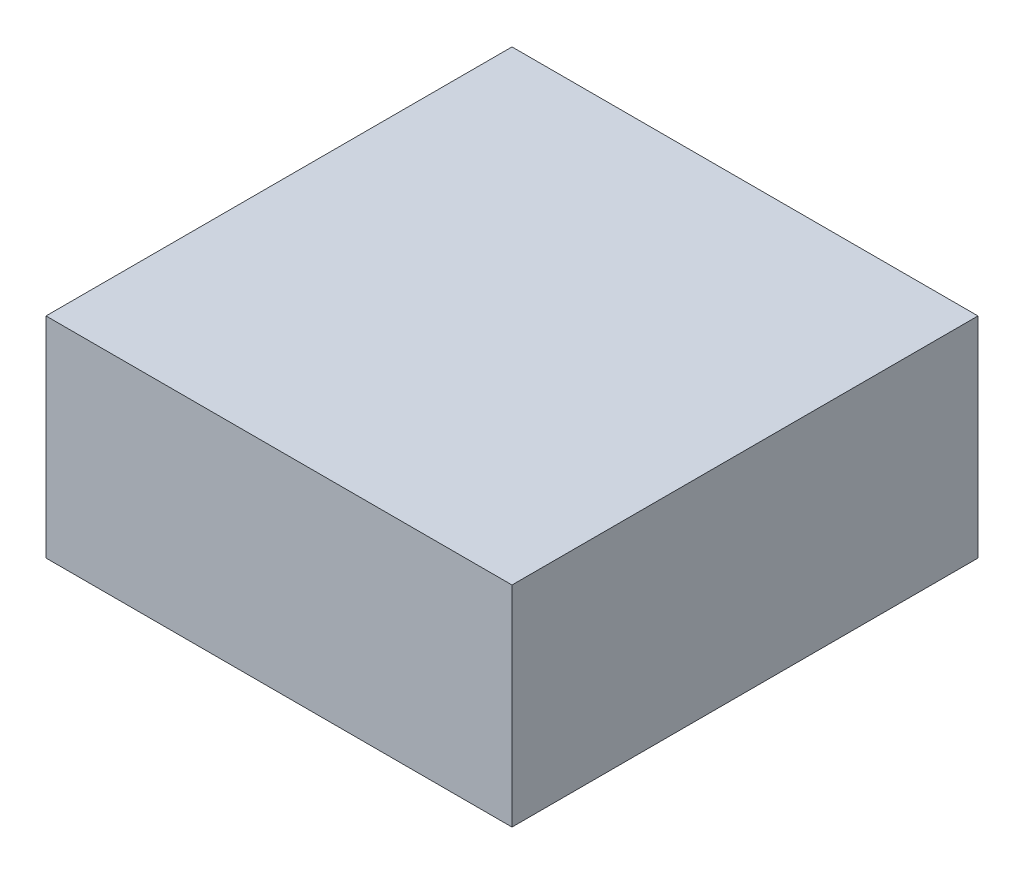
ISO-10303-21;
HEADER;
FILE_DESCRIPTION(('STEP AP214'),'2;1');
FILE_NAME('part.step','',(''),(''),'','','');
FILE_SCHEMA(('AUTOMOTIVE_DESIGN { 1 0 10303 214 1 1 1 1 }'));
ENDSEC;
DATA;
#1=APPLICATION_CONTEXT('core data for automotive mechanical design processes');
#2=APPLICATION_PROTOCOL_DEFINITION('international standard','automotive_design',2000,#1);
#3=PRODUCT_CONTEXT('',#1,'mechanical');
#4=PRODUCT('Part','Part','',(#3));
#5=PRODUCT_RELATED_PRODUCT_CATEGORY('part','',(#4));
#6=PRODUCT_DEFINITION_FORMATION('','',#4);
#7=PRODUCT_DEFINITION_CONTEXT('part definition',#1,'design');
#8=PRODUCT_DEFINITION('design','',#6,#7);
#9=PRODUCT_DEFINITION_SHAPE('','',#8);
#10=(LENGTH_UNIT() NAMED_UNIT(*) SI_UNIT(.MILLI.,.METRE.));
#11=(NAMED_UNIT(*) PLANE_ANGLE_UNIT() SI_UNIT($,.RADIAN.));
#12=(NAMED_UNIT(*) SI_UNIT($,.STERADIAN.) SOLID_ANGLE_UNIT());
#13=UNCERTAINTY_MEASURE_WITH_UNIT(LENGTH_MEASURE(1.E-05),#10,'distance_accuracy_value','');
#14=(GEOMETRIC_REPRESENTATION_CONTEXT(3) GLOBAL_UNCERTAINTY_ASSIGNED_CONTEXT((#13)) GLOBAL_UNIT_ASSIGNED_CONTEXT((#10,
#11,#12)) REPRESENTATION_CONTEXT('',''));
#15=CARTESIAN_POINT('',(0.,0.,0.));
#16=DIRECTION('',(0.,0.,1.));
#17=DIRECTION('',(1.,0.,0.));
#18=AXIS2_PLACEMENT_3D('',#15,#16,#17);
#19=CARTESIAN_POINT('',(-22.8675310919322,9.,-11.8124270711785));
#20=DIRECTION('',(1.,0.,0.));
#21=DIRECTION('',(0.,0.,-1.));
#22=AXIS2_PLACEMENT_3D('',#19,#20,#21);
#23=PLANE('',#22);
#24=DIRECTION('',(0.,0.,1.));
#25=VECTOR('',#24,1.);
#26=CARTESIAN_POINT('',(-22.8675310919322,0.,-11.8124270711785));
#27=LINE('',#26,#25);
#28=CARTESIAN_POINT('',(-22.8675310919322,0.,-11.8124270711785));
#29=VERTEX_POINT('',#28);
#30=CARTESIAN_POINT('',(-22.8675310919322,0.,8.18757292882147));
#31=VERTEX_POINT('',#30);
#32=EDGE_CURVE('E113',#29,#31,#27,.T.);
#33=ORIENTED_EDGE('',*,*,#32,.T.);
#34=DIRECTION('',(0.,-1.,0.));
#35=VECTOR('',#34,1.);
#36=CARTESIAN_POINT('',(-22.8675310919322,9.,8.18757292882147));
#37=LINE('',#36,#35);
#38=CARTESIAN_POINT('',(-22.8675310919322,9.,8.18757292882147));
#39=VERTEX_POINT('',#38);
#40=EDGE_CURVE('E11',#39,#31,#37,.T.);
#41=ORIENTED_EDGE('',*,*,#40,.F.);
#42=DIRECTION('',(0.,0.,1.));
#43=VECTOR('',#42,1.);
#44=CARTESIAN_POINT('',(-22.8675310919322,9.,-11.8124270711785));
#45=LINE('',#44,#43);
#46=CARTESIAN_POINT('',(-22.8675310919322,9.,-11.8124270711785));
#47=VERTEX_POINT('',#46);
#48=EDGE_CURVE('E97',#47,#39,#45,.T.);
#49=ORIENTED_EDGE('',*,*,#48,.F.);
#50=DIRECTION('',(0.,-1.,0.));
#51=VECTOR('',#50,1.);
#52=CARTESIAN_POINT('',(-22.8675310919322,9.,-11.8124270711785));
#53=LINE('',#52,#51);
#54=EDGE_CURVE('E109',#47,#29,#53,.T.);
#55=ORIENTED_EDGE('',*,*,#54,.T.);
#56=EDGE_LOOP('',(#33,#41,#49,#55));
#57=FACE_BOUND('',#56,.T.);
#58=ADVANCED_FACE('F45',(#57),#23,.F.);
#59=CARTESIAN_POINT('',(-22.8675310919322,9.,8.18757292882147));
#60=DIRECTION('',(0.,0.,-1.));
#61=DIRECTION('',(-1.,0.,0.));
#62=AXIS2_PLACEMENT_3D('',#59,#60,#61);
#63=PLANE('',#62);
#64=DIRECTION('',(1.,0.,0.));
#65=VECTOR('',#64,1.);
#66=CARTESIAN_POINT('',(-22.8675310919322,0.,8.18757292882147));
#67=LINE('',#66,#65);
#68=CARTESIAN_POINT('',(-2.86753109193223,0.,8.18757292882147));
#69=VERTEX_POINT('',#68);
#70=EDGE_CURVE('E102',#31,#69,#67,.T.);
#71=ORIENTED_EDGE('',*,*,#70,.T.);
#72=DIRECTION('',(0.,-1.,0.));
#73=VECTOR('',#72,1.);
#74=CARTESIAN_POINT('',(-2.86753109193223,9.,8.18757292882147));
#75=LINE('',#74,#73);
#76=CARTESIAN_POINT('',(-2.86753109193223,9.,8.18757292882147));
#77=VERTEX_POINT('',#76);
#78=EDGE_CURVE('E54',#77,#69,#75,.T.);
#79=ORIENTED_EDGE('',*,*,#78,.F.);
#80=DIRECTION('',(1.,0.,0.));
#81=VECTOR('',#80,1.);
#82=CARTESIAN_POINT('',(-22.8675310919322,9.,8.18757292882147));
#83=LINE('',#82,#81);
#84=EDGE_CURVE('E92',#39,#77,#83,.T.);
#85=ORIENTED_EDGE('',*,*,#84,.F.);
#86=ORIENTED_EDGE('',*,*,#40,.T.);
#87=EDGE_LOOP('',(#71,#79,#85,#86));
#88=FACE_BOUND('',#87,.T.);
#89=ADVANCED_FACE('F101',(#88),#63,.F.);
#90=CARTESIAN_POINT('',(-2.86753109193223,9.,-11.8124270711785));
#91=DIRECTION('',(-1.,0.,0.));
#92=DIRECTION('',(0.,0.,1.));
#93=AXIS2_PLACEMENT_3D('',#90,#91,#92);
#94=PLANE('',#93);
#95=DIRECTION('',(0.,0.,-1.));
#96=VECTOR('',#95,1.);
#97=CARTESIAN_POINT('',(-2.86753109193223,0.,-11.8124270711785));
#98=LINE('',#97,#96);
#99=CARTESIAN_POINT('',(-2.86753109193223,0.,-11.8124270711785));
#100=VERTEX_POINT('',#99);
#101=EDGE_CURVE('E79',#69,#100,#98,.T.);
#102=ORIENTED_EDGE('',*,*,#101,.T.);
#103=DIRECTION('',(0.,-1.,0.));
#104=VECTOR('',#103,1.);
#105=CARTESIAN_POINT('',(-2.86753109193223,9.,-11.8124270711785));
#106=LINE('',#105,#104);
#107=CARTESIAN_POINT('',(-2.86753109193223,9.,-11.8124270711785));
#108=VERTEX_POINT('',#107);
#109=EDGE_CURVE('E104',#108,#100,#106,.T.);
#110=ORIENTED_EDGE('',*,*,#109,.F.);
#111=DIRECTION('',(0.,0.,-1.));
#112=VECTOR('',#111,1.);
#113=CARTESIAN_POINT('',(-2.86753109193223,9.,-11.8124270711785));
#114=LINE('',#113,#112);
#115=EDGE_CURVE('E95',#77,#108,#114,.T.);
#116=ORIENTED_EDGE('',*,*,#115,.F.);
#117=ORIENTED_EDGE('',*,*,#78,.T.);
#118=EDGE_LOOP('',(#102,#110,#116,#117));
#119=FACE_BOUND('',#118,.T.);
#120=ADVANCED_FACE('F105',(#119),#94,.F.);
#121=CARTESIAN_POINT('',(-22.8675310919322,9.,-11.8124270711785));
#122=DIRECTION('',(0.,0.,1.));
#123=DIRECTION('',(1.,0.,0.));
#124=AXIS2_PLACEMENT_3D('',#121,#122,#123);
#125=PLANE('',#124);
#126=DIRECTION('',(-1.,0.,0.));
#127=VECTOR('',#126,1.);
#128=CARTESIAN_POINT('',(-22.8675310919322,0.,-11.8124270711785));
#129=LINE('',#128,#127);
#130=EDGE_CURVE('E85',#100,#29,#129,.T.);
#131=ORIENTED_EDGE('',*,*,#130,.T.);
#132=ORIENTED_EDGE('',*,*,#54,.F.);
#133=DIRECTION('',(-1.,0.,0.));
#134=VECTOR('',#133,1.);
#135=CARTESIAN_POINT('',(-22.8675310919322,9.,-11.8124270711785));
#136=LINE('',#135,#134);
#137=EDGE_CURVE('E62',#108,#47,#136,.T.);
#138=ORIENTED_EDGE('',*,*,#137,.F.);
#139=ORIENTED_EDGE('',*,*,#109,.T.);
#140=EDGE_LOOP('',(#131,#132,#138,#139));
#141=FACE_BOUND('',#140,.T.);
#142=ADVANCED_FACE('F126',(#141),#125,.F.);
#143=CARTESIAN_POINT('',(0.,9.,0.));
#144=DIRECTION('',(0.,1.,0.));
#145=DIRECTION('',(0.,0.,1.));
#146=AXIS2_PLACEMENT_3D('',#143,#144,#145);
#147=PLANE('',#146);
#148=ORIENTED_EDGE('',*,*,#48,.T.);
#149=ORIENTED_EDGE('',*,*,#84,.T.);
#150=ORIENTED_EDGE('',*,*,#115,.T.);
#151=ORIENTED_EDGE('',*,*,#137,.T.);
#152=EDGE_LOOP('',(#148,#149,#150,#151));
#153=FACE_BOUND('',#152,.T.);
#154=ADVANCED_FACE('F93',(#153),#147,.T.);
#155=CARTESIAN_POINT('',(0.,0.,0.));
#156=DIRECTION('',(0.,1.,0.));
#157=DIRECTION('',(0.,0.,1.));
#158=AXIS2_PLACEMENT_3D('',#155,#156,#157);
#159=PLANE('',#158);
#160=ORIENTED_EDGE('',*,*,#32,.F.);
#161=ORIENTED_EDGE('',*,*,#130,.F.);
#162=ORIENTED_EDGE('',*,*,#101,.F.);
#163=ORIENTED_EDGE('',*,*,#70,.F.);
#164=EDGE_LOOP('',(#160,#161,#162,#163));
#165=FACE_BOUND('',#164,.T.);
#166=ADVANCED_FACE('F129',(#165),#159,.F.);
#167=CLOSED_SHELL('',(#58,#89,#120,#142,#154,#166));
#168=MANIFOLD_SOLID_BREP('B2',#167);
#169=ADVANCED_BREP_SHAPE_REPRESENTATION('',(#18,#168),#14);
#170=SHAPE_DEFINITION_REPRESENTATION(#9,#169);
ENDSEC;
END-ISO-10303-21;
